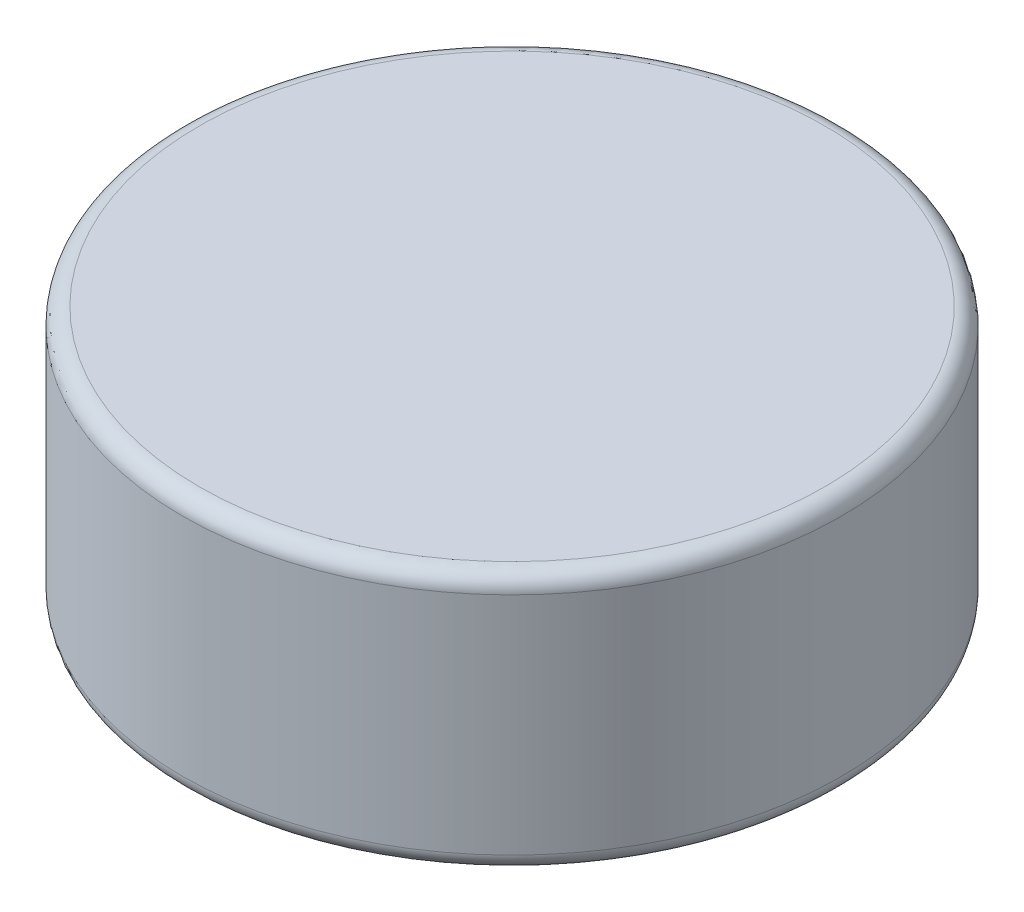
ISO-10303-21;
HEADER;
FILE_DESCRIPTION(('STEP AP214'),'2;1');
FILE_NAME('part.step','',(''),(''),'','','');
FILE_SCHEMA(('AUTOMOTIVE_DESIGN { 1 0 10303 214 1 1 1 1 }'));
ENDSEC;
DATA;
#1=APPLICATION_CONTEXT('core data for automotive mechanical design processes');
#2=APPLICATION_PROTOCOL_DEFINITION('international standard','automotive_design',2000,#1);
#3=PRODUCT_CONTEXT('',#1,'mechanical');
#4=PRODUCT('Part','Part','',(#3));
#5=PRODUCT_RELATED_PRODUCT_CATEGORY('part','',(#4));
#6=PRODUCT_DEFINITION_FORMATION('','',#4);
#7=PRODUCT_DEFINITION_CONTEXT('part definition',#1,'design');
#8=PRODUCT_DEFINITION('design','',#6,#7);
#9=PRODUCT_DEFINITION_SHAPE('','',#8);
#10=(LENGTH_UNIT() NAMED_UNIT(*) SI_UNIT(.MILLI.,.METRE.));
#11=(NAMED_UNIT(*) PLANE_ANGLE_UNIT() SI_UNIT($,.RADIAN.));
#12=(NAMED_UNIT(*) SI_UNIT($,.STERADIAN.) SOLID_ANGLE_UNIT());
#13=UNCERTAINTY_MEASURE_WITH_UNIT(LENGTH_MEASURE(1.E-05),#10,'distance_accuracy_value','');
#14=(GEOMETRIC_REPRESENTATION_CONTEXT(3) GLOBAL_UNCERTAINTY_ASSIGNED_CONTEXT((#13)) GLOBAL_UNIT_ASSIGNED_CONTEXT((#10,
#11,#12)) REPRESENTATION_CONTEXT('',''));
#15=CARTESIAN_POINT('',(0.,0.,0.));
#16=DIRECTION('',(0.,0.,1.));
#17=DIRECTION('',(1.,0.,0.));
#18=AXIS2_PLACEMENT_3D('',#15,#16,#17);
#19=CARTESIAN_POINT('',(0.,46.,0.));
#20=DIRECTION('',(0.,-1.,0.));
#21=DIRECTION('',(0.,0.,-1.));
#22=AXIS2_PLACEMENT_3D('',#19,#20,#21);
#23=CYLINDRICAL_SURFACE('',#22,58.5);
#24=CARTESIAN_POINT('',(0.,43.,0.));
#25=DIRECTION('',(0.,1.,0.));
#26=DIRECTION('',(0.,0.,1.));
#27=AXIS2_PLACEMENT_3D('',#24,#25,#26);
#28=CIRCLE('',#27,58.5);
#29=CARTESIAN_POINT('',(0.,43.,58.5));
#30=VERTEX_POINT('',#29);
#31=EDGE_CURVE('E45',#30,#30,#28,.F.);
#32=ORIENTED_EDGE('',*,*,#31,.T.);
#33=EDGE_LOOP('',(#32));
#34=FACE_BOUND('',#33,.T.);
#35=CARTESIAN_POINT('',(0.,3.,0.));
#36=DIRECTION('',(0.,1.,0.));
#37=DIRECTION('',(0.,0.,1.));
#38=AXIS2_PLACEMENT_3D('',#35,#36,#37);
#39=CIRCLE('',#38,58.5);
#40=CARTESIAN_POINT('',(0.,3.,58.5));
#41=VERTEX_POINT('',#40);
#42=EDGE_CURVE('E50',#41,#41,#39,.T.);
#43=ORIENTED_EDGE('',*,*,#42,.T.);
#44=EDGE_LOOP('',(#43));
#45=FACE_BOUND('',#44,.T.);
#46=ADVANCED_FACE('F37',(#34,#45),#23,.T.);
#47=CARTESIAN_POINT('',(0.,46.,0.));
#48=DIRECTION('',(0.,1.,0.));
#49=DIRECTION('',(0.,0.,1.));
#50=AXIS2_PLACEMENT_3D('',#47,#48,#49);
#51=PLANE('',#50);
#52=CARTESIAN_POINT('',(0.,46.,0.));
#53=DIRECTION('',(0.,1.,0.));
#54=DIRECTION('',(0.,0.,1.));
#55=AXIS2_PLACEMENT_3D('',#52,#53,#54);
#56=CIRCLE('',#55,55.5);
#57=CARTESIAN_POINT('',(0.,46.,55.5));
#58=VERTEX_POINT('',#57);
#59=EDGE_CURVE('E55',#58,#58,#56,.T.);
#60=ORIENTED_EDGE('',*,*,#59,.T.);
#61=EDGE_LOOP('',(#60));
#62=FACE_BOUND('',#61,.T.);
#63=ADVANCED_FACE('F62',(#62),#51,.T.);
#64=CARTESIAN_POINT('',(0.,0.,0.));
#65=DIRECTION('',(0.,1.,0.));
#66=DIRECTION('',(0.,0.,1.));
#67=AXIS2_PLACEMENT_3D('',#64,#65,#66);
#68=PLANE('',#67);
#69=CARTESIAN_POINT('',(0.,0.,0.));
#70=DIRECTION('',(0.,1.,0.));
#71=DIRECTION('',(0.,0.,1.));
#72=AXIS2_PLACEMENT_3D('',#69,#70,#71);
#73=CIRCLE('',#72,55.5);
#74=CARTESIAN_POINT('',(0.,0.,55.5));
#75=VERTEX_POINT('',#74);
#76=EDGE_CURVE('E10',#75,#75,#73,.F.);
#77=ORIENTED_EDGE('',*,*,#76,.T.);
#78=EDGE_LOOP('',(#77));
#79=FACE_BOUND('',#78,.T.);
#80=ADVANCED_FACE('F66',(#79),#68,.F.);
#81=CARTESIAN_POINT('',(0.,43.,0.));
#82=DIRECTION('',(0.,1.,0.));
#83=DIRECTION('',(0.,0.,1.));
#84=AXIS2_PLACEMENT_3D('',#81,#82,#83);
#85=TOROIDAL_SURFACE('',#84,55.5,3.);
#86=ORIENTED_EDGE('',*,*,#31,.F.);
#87=EDGE_LOOP('',(#86));
#88=FACE_BOUND('',#87,.T.);
#89=ORIENTED_EDGE('',*,*,#59,.F.);
#90=EDGE_LOOP('',(#89));
#91=FACE_BOUND('',#90,.T.);
#92=ADVANCED_FACE('F64',(#88,#91),#85,.T.);
#93=CARTESIAN_POINT('',(0.,3.,0.));
#94=DIRECTION('',(0.,1.,0.));
#95=DIRECTION('',(0.,0.,1.));
#96=AXIS2_PLACEMENT_3D('',#93,#94,#95);
#97=TOROIDAL_SURFACE('',#96,55.5,3.);
#98=ORIENTED_EDGE('',*,*,#76,.F.);
#99=EDGE_LOOP('',(#98));
#100=FACE_BOUND('',#99,.T.);
#101=ORIENTED_EDGE('',*,*,#42,.F.);
#102=EDGE_LOOP('',(#101));
#103=FACE_BOUND('',#102,.T.);
#104=ADVANCED_FACE('F39',(#100,#103),#97,.T.);
#105=CLOSED_SHELL('',(#46,#63,#80,#92,#104));
#106=MANIFOLD_SOLID_BREP('B2',#105);
#107=ADVANCED_BREP_SHAPE_REPRESENTATION('',(#18,#106),#14);
#108=SHAPE_DEFINITION_REPRESENTATION(#9,#107);
ENDSEC;
END-ISO-10303-21;
